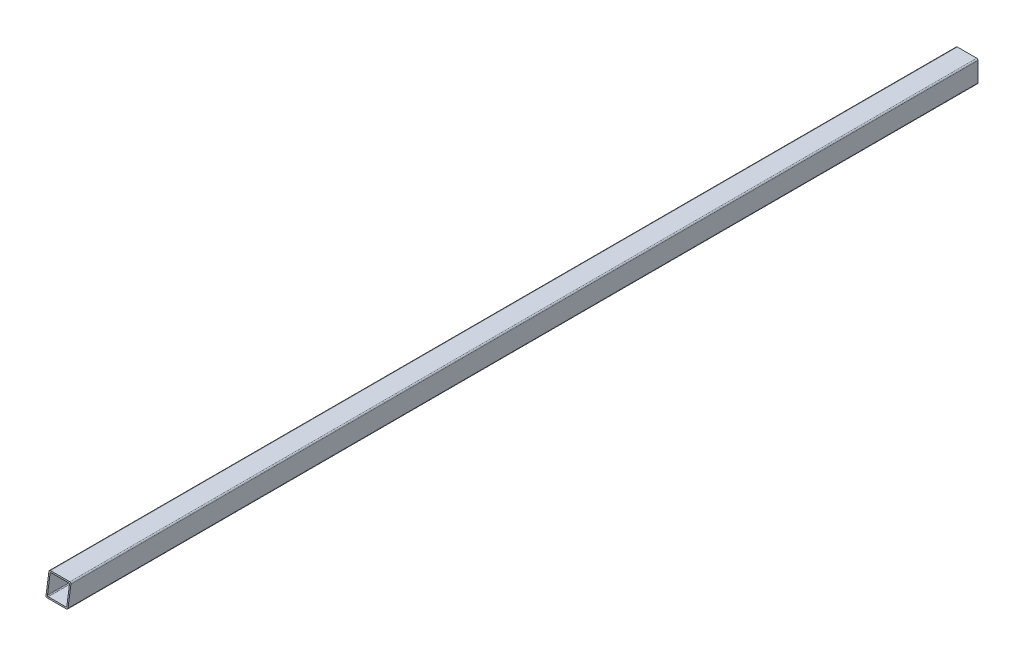
ISO-10303-21;
HEADER;
FILE_DESCRIPTION(('STEP AP214'),'2;1');
FILE_NAME('part.step','',(''),(''),'','','');
FILE_SCHEMA(('AUTOMOTIVE_DESIGN { 1 0 10303 214 1 1 1 1 }'));
ENDSEC;
DATA;
#1=APPLICATION_CONTEXT('core data for automotive mechanical design processes');
#2=APPLICATION_PROTOCOL_DEFINITION('international standard','automotive_design',2000,#1);
#3=PRODUCT_CONTEXT('',#1,'mechanical');
#4=PRODUCT('Part','Part','',(#3));
#5=PRODUCT_RELATED_PRODUCT_CATEGORY('part','',(#4));
#6=PRODUCT_DEFINITION_FORMATION('','',#4);
#7=PRODUCT_DEFINITION_CONTEXT('part definition',#1,'design');
#8=PRODUCT_DEFINITION('design','',#6,#7);
#9=PRODUCT_DEFINITION_SHAPE('','',#8);
#10=(LENGTH_UNIT() NAMED_UNIT(*) SI_UNIT(.MILLI.,.METRE.));
#11=(NAMED_UNIT(*) PLANE_ANGLE_UNIT() SI_UNIT($,.RADIAN.));
#12=(NAMED_UNIT(*) SI_UNIT($,.STERADIAN.) SOLID_ANGLE_UNIT());
#13=UNCERTAINTY_MEASURE_WITH_UNIT(LENGTH_MEASURE(1.E-05),#10,'distance_accuracy_value','');
#14=(GEOMETRIC_REPRESENTATION_CONTEXT(3) GLOBAL_UNCERTAINTY_ASSIGNED_CONTEXT((#13)) GLOBAL_UNIT_ASSIGNED_CONTEXT((#10,
#11,#12)) REPRESENTATION_CONTEXT('',''));
#15=CARTESIAN_POINT('',(0.,0.,0.));
#16=DIRECTION('',(0.,0.,1.));
#17=DIRECTION('',(1.,0.,0.));
#18=AXIS2_PLACEMENT_3D('',#15,#16,#17);
#19=CARTESIAN_POINT('',(5056.,2466.,100.000000000001));
#20=DIRECTION('',(0.,0.,1.));
#21=DIRECTION('',(1.,0.,0.));
#22=AXIS2_PLACEMENT_3D('',#19,#20,#21);
#23=PLANE('',#22);
#24=CARTESIAN_POINT('',(5056.,2466.,100.000000000001));
#25=DIRECTION('',(0.,0.,1.));
#26=DIRECTION('',(1.,0.,0.));
#27=AXIS2_PLACEMENT_3D('',#24,#25,#26);
#28=CIRCLE('',#27,6.00000000000023);
#29=CARTESIAN_POINT('',(5050.,2466.,100.000000000001));
#30=VERTEX_POINT('',#29);
#31=CARTESIAN_POINT('',(5056.,2460.,100.000000000001));
#32=VERTEX_POINT('',#31);
#33=EDGE_CURVE('E199',#30,#32,#28,.T.);
#34=ORIENTED_EDGE('',*,*,#33,.F.);
#35=DIRECTION('',(0.,-1.,0.));
#36=VECTOR('',#35,1.);
#37=CARTESIAN_POINT('',(5050.,2554.,100.000000000001));
#38=LINE('',#37,#36);
#39=CARTESIAN_POINT('',(5050.,2554.,100.000000000001));
#40=VERTEX_POINT('',#39);
#41=EDGE_CURVE('E161',#40,#30,#38,.T.);
#42=ORIENTED_EDGE('',*,*,#41,.F.);
#43=CARTESIAN_POINT('',(5056.,2554.,100.000000000001));
#44=DIRECTION('',(0.,0.,1.));
#45=DIRECTION('',(1.,0.,0.));
#46=AXIS2_PLACEMENT_3D('',#43,#44,#45);
#47=CIRCLE('',#46,6.00000000000001);
#48=CARTESIAN_POINT('',(5056.,2560.,100.000000000001));
#49=VERTEX_POINT('',#48);
#50=EDGE_CURVE('E157',#49,#40,#47,.T.);
#51=ORIENTED_EDGE('',*,*,#50,.F.);
#52=DIRECTION('',(-1.,0.,0.));
#53=VECTOR('',#52,1.);
#54=CARTESIAN_POINT('',(5056.,2560.,100.000000000001));
#55=LINE('',#54,#53);
#56=CARTESIAN_POINT('',(5144.,2560.,100.000000000001));
#57=VERTEX_POINT('',#56);
#58=EDGE_CURVE('E151',#57,#49,#55,.T.);
#59=ORIENTED_EDGE('',*,*,#58,.F.);
#60=CARTESIAN_POINT('',(5144.,2554.,100.000000000001));
#61=DIRECTION('',(0.,0.,1.));
#62=DIRECTION('',(-1.,0.,0.));
#63=AXIS2_PLACEMENT_3D('',#60,#61,#62);
#64=CIRCLE('',#63,6.00000000000001);
#65=CARTESIAN_POINT('',(5150.,2554.,100.000000000001));
#66=VERTEX_POINT('',#65);
#67=EDGE_CURVE('E218',#66,#57,#64,.T.);
#68=ORIENTED_EDGE('',*,*,#67,.F.);
#69=DIRECTION('',(0.,1.,0.));
#70=VECTOR('',#69,1.);
#71=CARTESIAN_POINT('',(5150.,2554.,100.000000000001));
#72=LINE('',#71,#70);
#73=CARTESIAN_POINT('',(5150.,2466.,100.000000000001));
#74=VERTEX_POINT('',#73);
#75=EDGE_CURVE('E208',#74,#66,#72,.T.);
#76=ORIENTED_EDGE('',*,*,#75,.F.);
#77=CARTESIAN_POINT('',(5144.,2466.,100.000000000001));
#78=DIRECTION('',(0.,0.,1.));
#79=DIRECTION('',(1.,0.,0.));
#80=AXIS2_PLACEMENT_3D('',#77,#78,#79);
#81=CIRCLE('',#80,6.00000000000023);
#82=CARTESIAN_POINT('',(5144.,2460.,100.000000000001));
#83=VERTEX_POINT('',#82);
#84=EDGE_CURVE('E214',#83,#74,#81,.T.);
#85=ORIENTED_EDGE('',*,*,#84,.F.);
#86=DIRECTION('',(1.,0.,0.));
#87=VECTOR('',#86,1.);
#88=CARTESIAN_POINT('',(5056.,2460.,100.000000000001));
#89=LINE('',#88,#87);
#90=EDGE_CURVE('E204',#32,#83,#89,.T.);
#91=ORIENTED_EDGE('',*,*,#90,.F.);
#92=EDGE_LOOP('',(#34,#42,#51,#59,#68,#76,#85,#91));
#93=FACE_BOUND('',#92,.T.);
#94=CARTESIAN_POINT('',(5060.,2470.,100.000000000001));
#95=DIRECTION('',(0.,0.,1.));
#96=DIRECTION('',(1.,0.,0.));
#97=AXIS2_PLACEMENT_3D('',#94,#95,#96);
#98=CIRCLE('',#97,3.99999999999978);
#99=CARTESIAN_POINT('',(5056.,2470.,100.000000000001));
#100=VERTEX_POINT('',#99);
#101=CARTESIAN_POINT('',(5060.,2466.,100.000000000001));
#102=VERTEX_POINT('',#101);
#103=EDGE_CURVE('E247',#100,#102,#98,.T.);
#104=ORIENTED_EDGE('',*,*,#103,.T.);
#105=DIRECTION('',(1.,0.,0.));
#106=VECTOR('',#105,1.);
#107=CARTESIAN_POINT('',(5060.,2466.,100.000000000001));
#108=LINE('',#107,#106);
#109=CARTESIAN_POINT('',(5140.,2466.,100.000000000001));
#110=VERTEX_POINT('',#109);
#111=EDGE_CURVE('E253',#102,#110,#108,.T.);
#112=ORIENTED_EDGE('',*,*,#111,.T.);
#113=CARTESIAN_POINT('',(5140.,2470.,100.000000000001));
#114=DIRECTION('',(0.,0.,1.));
#115=DIRECTION('',(1.,0.,0.));
#116=AXIS2_PLACEMENT_3D('',#113,#114,#115);
#117=CIRCLE('',#116,3.99999999999978);
#118=CARTESIAN_POINT('',(5144.,2470.,100.000000000001));
#119=VERTEX_POINT('',#118);
#120=EDGE_CURVE('E270',#110,#119,#117,.T.);
#121=ORIENTED_EDGE('',*,*,#120,.T.);
#122=DIRECTION('',(0.,1.,0.));
#123=VECTOR('',#122,1.);
#124=CARTESIAN_POINT('',(5144.,2550.,100.000000000001));
#125=LINE('',#124,#123);
#126=CARTESIAN_POINT('',(5144.,2550.,100.000000000001));
#127=VERTEX_POINT('',#126);
#128=EDGE_CURVE('E267',#119,#127,#125,.T.);
#129=ORIENTED_EDGE('',*,*,#128,.T.);
#130=CARTESIAN_POINT('',(5140.,2550.,100.000000000001));
#131=DIRECTION('',(0.,0.,1.));
#132=DIRECTION('',(-1.,0.,0.));
#133=AXIS2_PLACEMENT_3D('',#130,#131,#132);
#134=CIRCLE('',#133,3.99999999999978);
#135=CARTESIAN_POINT('',(5140.,2554.,100.000000000001));
#136=VERTEX_POINT('',#135);
#137=EDGE_CURVE('E264',#127,#136,#134,.T.);
#138=ORIENTED_EDGE('',*,*,#137,.T.);
#139=DIRECTION('',(-1.,0.,0.));
#140=VECTOR('',#139,1.);
#141=CARTESIAN_POINT('',(5060.,2554.,100.000000000001));
#142=LINE('',#141,#140);
#143=CARTESIAN_POINT('',(5060.,2554.,100.000000000001));
#144=VERTEX_POINT('',#143);
#145=EDGE_CURVE('E258',#136,#144,#142,.T.);
#146=ORIENTED_EDGE('',*,*,#145,.T.);
#147=CARTESIAN_POINT('',(5060.,2550.,100.000000000001));
#148=DIRECTION('',(0.,0.,1.));
#149=DIRECTION('',(1.,0.,0.));
#150=AXIS2_PLACEMENT_3D('',#147,#148,#149);
#151=CIRCLE('',#150,3.99999999999978);
#152=CARTESIAN_POINT('',(5056.,2550.,100.000000000001));
#153=VERTEX_POINT('',#152);
#154=EDGE_CURVE('E256',#144,#153,#151,.T.);
#155=ORIENTED_EDGE('',*,*,#154,.T.);
#156=DIRECTION('',(0.,-1.,0.));
#157=VECTOR('',#156,1.);
#158=CARTESIAN_POINT('',(5056.,2550.,100.000000000001));
#159=LINE('',#158,#157);
#160=EDGE_CURVE('E194',#153,#100,#159,.T.);
#161=ORIENTED_EDGE('',*,*,#160,.T.);
#162=EDGE_LOOP('',(#104,#112,#121,#129,#138,#146,#155,#161));
#163=FACE_BOUND('',#162,.T.);
#164=ADVANCED_FACE('F35',(#93,#163),#23,.F.);
#165=CARTESIAN_POINT('',(5056.,2466.,4369.08780731511));
#166=DIRECTION('',(0.,0.,-1.));
#167=DIRECTION('',(-1.,0.,0.));
#168=AXIS2_PLACEMENT_3D('',#165,#166,#167);
#169=CYLINDRICAL_SURFACE('',#168,6.00000000000023);
#170=DIRECTION('',(0.,0.,-1.));
#171=VECTOR('',#170,1.);
#172=CARTESIAN_POINT('',(5056.,2460.,4369.08780731511));
#173=LINE('',#172,#171);
#174=CARTESIAN_POINT('',(5056.,2460.,4234.32196361362));
#175=VERTEX_POINT('',#174);
#176=EDGE_CURVE('E198',#175,#32,#173,.T.);
#177=ORIENTED_EDGE('',*,*,#176,.F.);
#178=CARTESIAN_POINT('',(5056.,2466.,4233.4300659639));
#179=DIRECTION('',(0.,-0.147034000874357,-0.989131438478668));
#180=DIRECTION('',(0.,0.989131438478668,-0.147034000874357));
#181=AXIS2_PLACEMENT_3D('',#178,#179,#180);
#182=ELLIPSE('',#181,6.06592791068143,6.00000000000023);
#183=CARTESIAN_POINT('',(5050.,2466.,4233.4300659639));
#184=VERTEX_POINT('',#183);
#185=EDGE_CURVE('E192',#175,#184,#182,.T.);
#186=ORIENTED_EDGE('',*,*,#185,.T.);
#187=DIRECTION('',(0.,0.,-1.));
#188=VECTOR('',#187,1.);
#189=CARTESIAN_POINT('',(5050.,2466.,4369.08780731511));
#190=LINE('',#189,#188);
#191=EDGE_CURVE('E165',#184,#30,#190,.T.);
#192=ORIENTED_EDGE('',*,*,#191,.T.);
#193=ORIENTED_EDGE('',*,*,#33,.T.);
#194=EDGE_LOOP('',(#177,#186,#192,#193));
#195=FACE_BOUND('',#194,.T.);
#196=ADVANCED_FACE('F302',(#195),#169,.T.);
#197=CARTESIAN_POINT('',(5056.,2460.,4369.08780731511));
#198=DIRECTION('',(0.,1.,0.));
#199=DIRECTION('',(0.,0.,1.));
#200=AXIS2_PLACEMENT_3D('',#197,#198,#199);
#201=PLANE('',#200);
#202=DIRECTION('',(0.,0.,-1.));
#203=VECTOR('',#202,1.);
#204=CARTESIAN_POINT('',(5144.,2460.,4369.08780731511));
#205=LINE('',#204,#203);
#206=CARTESIAN_POINT('',(5144.,2460.,4234.32196361362));
#207=VERTEX_POINT('',#206);
#208=EDGE_CURVE('E203',#207,#83,#205,.T.);
#209=ORIENTED_EDGE('',*,*,#208,.F.);
#210=DIRECTION('',(-1.,0.,0.));
#211=VECTOR('',#210,1.);
#212=CARTESIAN_POINT('',(5056.,2460.,4234.32196361362));
#213=LINE('',#212,#211);
#214=EDGE_CURVE('E195',#207,#175,#213,.T.);
#215=ORIENTED_EDGE('',*,*,#214,.T.);
#216=ORIENTED_EDGE('',*,*,#176,.T.);
#217=ORIENTED_EDGE('',*,*,#90,.T.);
#218=EDGE_LOOP('',(#209,#215,#216,#217));
#219=FACE_BOUND('',#218,.T.);
#220=ADVANCED_FACE('F308',(#219),#201,.F.);
#221=CARTESIAN_POINT('',(5144.,2466.,4369.08780731511));
#222=DIRECTION('',(0.,0.,-1.));
#223=DIRECTION('',(-1.,0.,0.));
#224=AXIS2_PLACEMENT_3D('',#221,#222,#223);
#225=CYLINDRICAL_SURFACE('',#224,6.00000000000023);
#226=DIRECTION('',(0.,0.,-1.));
#227=VECTOR('',#226,1.);
#228=CARTESIAN_POINT('',(5150.,2466.,4369.08780731511));
#229=LINE('',#228,#227);
#230=CARTESIAN_POINT('',(5150.,2466.,4233.43006596389));
#231=VERTEX_POINT('',#230);
#232=EDGE_CURVE('E215',#231,#74,#229,.T.);
#233=ORIENTED_EDGE('',*,*,#232,.F.);
#234=CARTESIAN_POINT('',(5144.,2466.,4233.4300659639));
#235=DIRECTION('',(0.,-0.147034000874357,-0.989131438478668));
#236=DIRECTION('',(0.,0.989131438478668,-0.147034000874357));
#237=AXIS2_PLACEMENT_3D('',#234,#235,#236);
#238=ELLIPSE('',#237,6.06592791068143,6.00000000000023);
#239=EDGE_CURVE('E200',#231,#207,#238,.T.);
#240=ORIENTED_EDGE('',*,*,#239,.T.);
#241=ORIENTED_EDGE('',*,*,#208,.T.);
#242=ORIENTED_EDGE('',*,*,#84,.T.);
#243=EDGE_LOOP('',(#233,#240,#241,#242));
#244=FACE_BOUND('',#243,.T.);
#245=ADVANCED_FACE('F328',(#244),#225,.T.);
#246=CARTESIAN_POINT('',(5150.,2554.,4369.08780731511));
#247=DIRECTION('',(-1.,0.,0.));
#248=DIRECTION('',(0.,0.,1.));
#249=AXIS2_PLACEMENT_3D('',#246,#247,#248);
#250=PLANE('',#249);
#251=DIRECTION('',(0.,0.,-1.));
#252=VECTOR('',#251,1.);
#253=CARTESIAN_POINT('',(5150.,2554.,4369.08780731511));
#254=LINE('',#253,#252);
#255=CARTESIAN_POINT('',(5150.,2554.,4220.34890043463));
#256=VERTEX_POINT('',#255);
#257=EDGE_CURVE('E207',#256,#66,#254,.T.);
#258=ORIENTED_EDGE('',*,*,#257,.F.);
#259=DIRECTION('',(0.,0.989131438478668,-0.147034000874357));
#260=VECTOR('',#259,1.);
#261=CARTESIAN_POINT('',(5150.,2560.,4219.4570027849));
#262=LINE('',#261,#260);
#263=EDGE_CURVE('E11',#231,#256,#262,.T.);
#264=ORIENTED_EDGE('',*,*,#263,.F.);
#265=ORIENTED_EDGE('',*,*,#232,.T.);
#266=ORIENTED_EDGE('',*,*,#75,.T.);
#267=EDGE_LOOP('',(#258,#264,#265,#266));
#268=FACE_BOUND('',#267,.T.);
#269=ADVANCED_FACE('F324',(#268),#250,.F.);
#270=CARTESIAN_POINT('',(5144.,2554.,4369.08780731511));
#271=DIRECTION('',(0.,0.,-1.));
#272=DIRECTION('',(-1.,0.,0.));
#273=AXIS2_PLACEMENT_3D('',#270,#271,#272);
#274=CYLINDRICAL_SURFACE('',#273,6.00000000000001);
#275=DIRECTION('',(0.,0.,-1.));
#276=VECTOR('',#275,1.);
#277=CARTESIAN_POINT('',(5144.,2560.,4369.08780731511));
#278=LINE('',#277,#276);
#279=CARTESIAN_POINT('',(5144.,2560.,4219.4570027849));
#280=VERTEX_POINT('',#279);
#281=EDGE_CURVE('E219',#280,#57,#278,.T.);
#282=ORIENTED_EDGE('',*,*,#281,.F.);
#283=CARTESIAN_POINT('',(5144.,2554.,4220.34890043463));
#284=DIRECTION('',(0.,-0.147034000874357,-0.989131438478668));
#285=DIRECTION('',(0.,0.989131438478668,-0.147034000874357));
#286=AXIS2_PLACEMENT_3D('',#283,#284,#285);
#287=ELLIPSE('',#286,6.06592791068121,6.00000000000001);
#288=EDGE_CURVE('E205',#280,#256,#287,.T.);
#289=ORIENTED_EDGE('',*,*,#288,.T.);
#290=ORIENTED_EDGE('',*,*,#257,.T.);
#291=ORIENTED_EDGE('',*,*,#67,.T.);
#292=EDGE_LOOP('',(#282,#289,#290,#291));
#293=FACE_BOUND('',#292,.T.);
#294=ADVANCED_FACE('F320',(#293),#274,.T.);
#295=CARTESIAN_POINT('',(5056.,2560.,4369.08780731511));
#296=DIRECTION('',(0.,-1.,0.));
#297=DIRECTION('',(0.,0.,-1.));
#298=AXIS2_PLACEMENT_3D('',#295,#296,#297);
#299=PLANE('',#298);
#300=DIRECTION('',(0.,0.,-1.));
#301=VECTOR('',#300,1.);
#302=CARTESIAN_POINT('',(5056.,2560.,4369.08780731511));
#303=LINE('',#302,#301);
#304=CARTESIAN_POINT('',(5056.,2560.,4219.4570027849));
#305=VERTEX_POINT('',#304);
#306=EDGE_CURVE('E150',#305,#49,#303,.T.);
#307=ORIENTED_EDGE('',*,*,#306,.F.);
#308=DIRECTION('',(-1.,0.,0.));
#309=VECTOR('',#308,1.);
#310=CARTESIAN_POINT('',(0.,2560.,4219.4570027849));
#311=LINE('',#310,#309);
#312=EDGE_CURVE('E45',#280,#305,#311,.T.);
#313=ORIENTED_EDGE('',*,*,#312,.F.);
#314=ORIENTED_EDGE('',*,*,#281,.T.);
#315=ORIENTED_EDGE('',*,*,#58,.T.);
#316=EDGE_LOOP('',(#307,#313,#314,#315));
#317=FACE_BOUND('',#316,.T.);
#318=ADVANCED_FACE('F317',(#317),#299,.F.);
#319=CARTESIAN_POINT('',(5056.,2554.,4369.08780731511));
#320=DIRECTION('',(0.,0.,-1.));
#321=DIRECTION('',(-1.,0.,0.));
#322=AXIS2_PLACEMENT_3D('',#319,#320,#321);
#323=CYLINDRICAL_SURFACE('',#322,6.00000000000001);
#324=DIRECTION('',(0.,0.,-1.));
#325=VECTOR('',#324,1.);
#326=CARTESIAN_POINT('',(5050.,2554.,4369.08780731511));
#327=LINE('',#326,#325);
#328=CARTESIAN_POINT('',(5050.,2554.,4220.34890043463));
#329=VERTEX_POINT('',#328);
#330=EDGE_CURVE('E154',#329,#40,#327,.T.);
#331=ORIENTED_EDGE('',*,*,#330,.F.);
#332=CARTESIAN_POINT('',(5056.,2554.,4220.34890043463));
#333=DIRECTION('',(0.,-0.147034000874357,-0.989131438478668));
#334=DIRECTION('',(0.,0.989131438478668,-0.147034000874357));
#335=AXIS2_PLACEMENT_3D('',#332,#333,#334);
#336=ELLIPSE('',#335,6.06592791068121,6.00000000000001);
#337=EDGE_CURVE('E142',#329,#305,#336,.T.);
#338=ORIENTED_EDGE('',*,*,#337,.T.);
#339=ORIENTED_EDGE('',*,*,#306,.T.);
#340=ORIENTED_EDGE('',*,*,#50,.T.);
#341=EDGE_LOOP('',(#331,#338,#339,#340));
#342=FACE_BOUND('',#341,.T.);
#343=ADVANCED_FACE('F155',(#342),#323,.T.);
#344=CARTESIAN_POINT('',(5050.,2554.,4369.08780731511));
#345=DIRECTION('',(1.,0.,0.));
#346=DIRECTION('',(0.,0.,-1.));
#347=AXIS2_PLACEMENT_3D('',#344,#345,#346);
#348=PLANE('',#347);
#349=ORIENTED_EDGE('',*,*,#191,.F.);
#350=DIRECTION('',(0.,0.989131438478668,-0.147034000874357));
#351=VECTOR('',#350,1.);
#352=CARTESIAN_POINT('',(5050.,2532.36801536087,4223.56448647771));
#353=LINE('',#352,#351);
#354=EDGE_CURVE('E145',#184,#329,#353,.T.);
#355=ORIENTED_EDGE('',*,*,#354,.T.);
#356=ORIENTED_EDGE('',*,*,#330,.T.);
#357=ORIENTED_EDGE('',*,*,#41,.T.);
#358=EDGE_LOOP('',(#349,#355,#356,#357));
#359=FACE_BOUND('',#358,.T.);
#360=ADVANCED_FACE('F164',(#359),#348,.F.);
#361=CARTESIAN_POINT('',(5060.,2470.,4369.08780731511));
#362=DIRECTION('',(0.,0.,-1.));
#363=DIRECTION('',(-1.,0.,0.));
#364=AXIS2_PLACEMENT_3D('',#361,#362,#363);
#365=CYLINDRICAL_SURFACE('',#364,3.99999999999978);
#366=CARTESIAN_POINT('',(5060.,2470.,4232.83546753075));
#367=DIRECTION('',(0.,-0.147034000874357,-0.989131438478668));
#368=DIRECTION('',(0.,0.989131438478668,-0.147034000874357));
#369=AXIS2_PLACEMENT_3D('',#366,#367,#368);
#370=ELLIPSE('',#369,4.04395194045391,3.99999999999978);
#371=CARTESIAN_POINT('',(5060.,2466.,4233.4300659639));
#372=VERTEX_POINT('',#371);
#373=CARTESIAN_POINT('',(5056.,2470.,4232.83546753075));
#374=VERTEX_POINT('',#373);
#375=EDGE_CURVE('E170',#372,#374,#370,.T.);
#376=ORIENTED_EDGE('',*,*,#375,.F.);
#377=DIRECTION('',(0.,0.,-1.));
#378=VECTOR('',#377,1.);
#379=CARTESIAN_POINT('',(5060.,2466.,4369.08780731511));
#380=LINE('',#379,#378);
#381=EDGE_CURVE('E223',#372,#102,#380,.T.);
#382=ORIENTED_EDGE('',*,*,#381,.T.);
#383=ORIENTED_EDGE('',*,*,#103,.F.);
#384=DIRECTION('',(0.,0.,-1.));
#385=VECTOR('',#384,1.);
#386=CARTESIAN_POINT('',(5056.,2470.,4369.08780731511));
#387=LINE('',#386,#385);
#388=EDGE_CURVE('E39',#374,#100,#387,.T.);
#389=ORIENTED_EDGE('',*,*,#388,.F.);
#390=EDGE_LOOP('',(#376,#382,#383,#389));
#391=FACE_BOUND('',#390,.T.);
#392=ADVANCED_FACE('F248',(#391),#365,.F.);
#393=CARTESIAN_POINT('',(5060.,2466.,4369.08780731511));
#394=DIRECTION('',(0.,1.,0.));
#395=DIRECTION('',(0.,0.,1.));
#396=AXIS2_PLACEMENT_3D('',#393,#394,#395);
#397=PLANE('',#396);
#398=DIRECTION('',(-1.,0.,0.));
#399=VECTOR('',#398,1.);
#400=CARTESIAN_POINT('',(5060.,2466.,4233.4300659639));
#401=LINE('',#400,#399);
#402=CARTESIAN_POINT('',(5140.,2466.,4233.4300659639));
#403=VERTEX_POINT('',#402);
#404=EDGE_CURVE('E174',#403,#372,#401,.T.);
#405=ORIENTED_EDGE('',*,*,#404,.F.);
#406=DIRECTION('',(0.,0.,-1.));
#407=VECTOR('',#406,1.);
#408=CARTESIAN_POINT('',(5140.,2466.,4369.08780731511));
#409=LINE('',#408,#407);
#410=EDGE_CURVE('E225',#403,#110,#409,.T.);
#411=ORIENTED_EDGE('',*,*,#410,.T.);
#412=ORIENTED_EDGE('',*,*,#111,.F.);
#413=ORIENTED_EDGE('',*,*,#381,.F.);
#414=EDGE_LOOP('',(#405,#411,#412,#413));
#415=FACE_BOUND('',#414,.T.);
#416=ADVANCED_FACE('F275',(#415),#397,.T.);
#417=CARTESIAN_POINT('',(5140.,2470.,4369.08780731511));
#418=DIRECTION('',(0.,0.,-1.));
#419=DIRECTION('',(-1.,0.,0.));
#420=AXIS2_PLACEMENT_3D('',#417,#418,#419);
#421=CYLINDRICAL_SURFACE('',#420,3.99999999999978);
#422=CARTESIAN_POINT('',(5140.,2470.,4232.83546753075));
#423=DIRECTION('',(0.,-0.147034000874357,-0.989131438478668));
#424=DIRECTION('',(0.,0.989131438478668,-0.147034000874357));
#425=AXIS2_PLACEMENT_3D('',#422,#423,#424);
#426=ELLIPSE('',#425,4.04395194045391,3.99999999999978);
#427=CARTESIAN_POINT('',(5144.,2470.,4232.83546753075));
#428=VERTEX_POINT('',#427);
#429=EDGE_CURVE('E177',#428,#403,#426,.T.);
#430=ORIENTED_EDGE('',*,*,#429,.F.);
#431=DIRECTION('',(0.,0.,-1.));
#432=VECTOR('',#431,1.);
#433=CARTESIAN_POINT('',(5144.,2470.,4369.08780731511));
#434=LINE('',#433,#432);
#435=EDGE_CURVE('E227',#428,#119,#434,.T.);
#436=ORIENTED_EDGE('',*,*,#435,.T.);
#437=ORIENTED_EDGE('',*,*,#120,.F.);
#438=ORIENTED_EDGE('',*,*,#410,.F.);
#439=EDGE_LOOP('',(#430,#436,#437,#438));
#440=FACE_BOUND('',#439,.T.);
#441=ADVANCED_FACE('F278',(#440),#421,.F.);
#442=CARTESIAN_POINT('',(5144.,2550.,4369.08780731511));
#443=DIRECTION('',(-1.,0.,0.));
#444=DIRECTION('',(0.,0.,1.));
#445=AXIS2_PLACEMENT_3D('',#442,#443,#444);
#446=PLANE('',#445);
#447=DIRECTION('',(0.,-0.989131438478668,0.147034000874357));
#448=VECTOR('',#447,1.);
#449=CARTESIAN_POINT('',(5144.,2528.45449135053,4224.14623028887));
#450=LINE('',#449,#448);
#451=CARTESIAN_POINT('',(5144.,2550.,4220.94349886778));
#452=VERTEX_POINT('',#451);
#453=EDGE_CURVE('E180',#452,#428,#450,.T.);
#454=ORIENTED_EDGE('',*,*,#453,.F.);
#455=DIRECTION('',(0.,0.,-1.));
#456=VECTOR('',#455,1.);
#457=CARTESIAN_POINT('',(5144.,2550.,4369.08780731511));
#458=LINE('',#457,#456);
#459=EDGE_CURVE('E229',#452,#127,#458,.T.);
#460=ORIENTED_EDGE('',*,*,#459,.T.);
#461=ORIENTED_EDGE('',*,*,#128,.F.);
#462=ORIENTED_EDGE('',*,*,#435,.F.);
#463=EDGE_LOOP('',(#454,#460,#461,#462));
#464=FACE_BOUND('',#463,.T.);
#465=ADVANCED_FACE('F282',(#464),#446,.T.);
#466=CARTESIAN_POINT('',(5140.,2550.,4369.08780731511));
#467=DIRECTION('',(0.,0.,-1.));
#468=DIRECTION('',(-1.,0.,0.));
#469=AXIS2_PLACEMENT_3D('',#466,#467,#468);
#470=CYLINDRICAL_SURFACE('',#469,3.99999999999978);
#471=CARTESIAN_POINT('',(5140.,2550.,4220.94349886778));
#472=DIRECTION('',(0.,-0.147034000874357,-0.989131438478668));
#473=DIRECTION('',(0.,0.989131438478668,-0.147034000874357));
#474=AXIS2_PLACEMENT_3D('',#471,#472,#473);
#475=ELLIPSE('',#474,4.04395194045391,3.99999999999978);
#476=CARTESIAN_POINT('',(5140.,2554.,4220.34890043463));
#477=VERTEX_POINT('',#476);
#478=EDGE_CURVE('E183',#477,#452,#475,.T.);
#479=ORIENTED_EDGE('',*,*,#478,.F.);
#480=DIRECTION('',(0.,0.,-1.));
#481=VECTOR('',#480,1.);
#482=CARTESIAN_POINT('',(5140.,2554.,4369.08780731511));
#483=LINE('',#482,#481);
#484=EDGE_CURVE('E231',#477,#136,#483,.T.);
#485=ORIENTED_EDGE('',*,*,#484,.T.);
#486=ORIENTED_EDGE('',*,*,#137,.F.);
#487=ORIENTED_EDGE('',*,*,#459,.F.);
#488=EDGE_LOOP('',(#479,#485,#486,#487));
#489=FACE_BOUND('',#488,.T.);
#490=ADVANCED_FACE('F287',(#489),#470,.F.);
#491=CARTESIAN_POINT('',(5060.,2554.,4369.08780731511));
#492=DIRECTION('',(0.,-1.,0.));
#493=DIRECTION('',(0.,0.,-1.));
#494=AXIS2_PLACEMENT_3D('',#491,#492,#493);
#495=PLANE('',#494);
#496=DIRECTION('',(1.,0.,0.));
#497=VECTOR('',#496,1.);
#498=CARTESIAN_POINT('',(5060.,2554.,4220.34890043463));
#499=LINE('',#498,#497);
#500=CARTESIAN_POINT('',(5060.,2554.,4220.34890043463));
#501=VERTEX_POINT('',#500);
#502=EDGE_CURVE('E186',#501,#477,#499,.T.);
#503=ORIENTED_EDGE('',*,*,#502,.F.);
#504=DIRECTION('',(0.,0.,-1.));
#505=VECTOR('',#504,1.);
#506=CARTESIAN_POINT('',(5060.,2554.,4369.08780731511));
#507=LINE('',#506,#505);
#508=EDGE_CURVE('E233',#501,#144,#507,.T.);
#509=ORIENTED_EDGE('',*,*,#508,.T.);
#510=ORIENTED_EDGE('',*,*,#145,.F.);
#511=ORIENTED_EDGE('',*,*,#484,.F.);
#512=EDGE_LOOP('',(#503,#509,#510,#511));
#513=FACE_BOUND('',#512,.T.);
#514=ADVANCED_FACE('F290',(#513),#495,.T.);
#515=CARTESIAN_POINT('',(5060.,2550.,4369.08780731511));
#516=DIRECTION('',(0.,0.,-1.));
#517=DIRECTION('',(-1.,0.,0.));
#518=AXIS2_PLACEMENT_3D('',#515,#516,#517);
#519=CYLINDRICAL_SURFACE('',#518,3.99999999999978);
#520=CARTESIAN_POINT('',(5060.,2550.,4220.94349886778));
#521=DIRECTION('',(0.,-0.147034000874357,-0.989131438478668));
#522=DIRECTION('',(0.,0.989131438478668,-0.147034000874357));
#523=AXIS2_PLACEMENT_3D('',#520,#521,#522);
#524=ELLIPSE('',#523,4.04395194045391,3.99999999999978);
#525=CARTESIAN_POINT('',(5056.,2550.,4220.94349886778));
#526=VERTEX_POINT('',#525);
#527=EDGE_CURVE('E189',#526,#501,#524,.T.);
#528=ORIENTED_EDGE('',*,*,#527,.F.);
#529=DIRECTION('',(0.,0.,-1.));
#530=VECTOR('',#529,1.);
#531=CARTESIAN_POINT('',(5056.,2550.,4369.08780731511));
#532=LINE('',#531,#530);
#533=EDGE_CURVE('E234',#526,#153,#532,.T.);
#534=ORIENTED_EDGE('',*,*,#533,.T.);
#535=ORIENTED_EDGE('',*,*,#154,.F.);
#536=ORIENTED_EDGE('',*,*,#508,.F.);
#537=EDGE_LOOP('',(#528,#534,#535,#536));
#538=FACE_BOUND('',#537,.T.);
#539=ADVANCED_FACE('F292',(#538),#519,.F.);
#540=CARTESIAN_POINT('',(5056.,2550.,4369.08780731511));
#541=DIRECTION('',(1.,0.,0.));
#542=DIRECTION('',(0.,0.,-1.));
#543=AXIS2_PLACEMENT_3D('',#540,#541,#542);
#544=PLANE('',#543);
#545=DIRECTION('',(0.,0.989131438478668,-0.147034000874357));
#546=VECTOR('',#545,1.);
#547=CARTESIAN_POINT('',(5056.,2528.45449135053,4224.14623028887));
#548=LINE('',#547,#546);
#549=EDGE_CURVE('E173',#374,#526,#548,.T.);
#550=ORIENTED_EDGE('',*,*,#549,.F.);
#551=ORIENTED_EDGE('',*,*,#388,.T.);
#552=ORIENTED_EDGE('',*,*,#160,.F.);
#553=ORIENTED_EDGE('',*,*,#533,.F.);
#554=EDGE_LOOP('',(#550,#551,#552,#553));
#555=FACE_BOUND('',#554,.T.);
#556=ADVANCED_FACE('F242',(#555),#544,.T.);
#557=CARTESIAN_POINT('',(1.44222364974975E-13,669.005382834581,4500.55261189965));
#558=DIRECTION('',(0.,-0.147034000874357,-0.989131438478668));
#559=DIRECTION('',(0.,0.989131438478668,-0.147034000874357));
#560=AXIS2_PLACEMENT_3D('',#557,#558,#559);
#561=PLANE('',#560);
#562=ORIENTED_EDGE('',*,*,#404,.T.);
#563=ORIENTED_EDGE('',*,*,#375,.T.);
#564=ORIENTED_EDGE('',*,*,#549,.T.);
#565=ORIENTED_EDGE('',*,*,#527,.T.);
#566=ORIENTED_EDGE('',*,*,#502,.T.);
#567=ORIENTED_EDGE('',*,*,#478,.T.);
#568=ORIENTED_EDGE('',*,*,#453,.T.);
#569=ORIENTED_EDGE('',*,*,#429,.T.);
#570=EDGE_LOOP('',(#562,#563,#564,#565,#566,#567,#568,#569));
#571=FACE_BOUND('',#570,.T.);
#572=ORIENTED_EDGE('',*,*,#288,.F.);
#573=ORIENTED_EDGE('',*,*,#312,.T.);
#574=ORIENTED_EDGE('',*,*,#337,.F.);
#575=ORIENTED_EDGE('',*,*,#354,.F.);
#576=ORIENTED_EDGE('',*,*,#185,.F.);
#577=ORIENTED_EDGE('',*,*,#214,.F.);
#578=ORIENTED_EDGE('',*,*,#239,.F.);
#579=ORIENTED_EDGE('',*,*,#263,.T.);
#580=EDGE_LOOP('',(#572,#573,#574,#575,#576,#577,#578,#579));
#581=FACE_BOUND('',#580,.T.);
#582=ADVANCED_FACE('F37',(#571,#581),#561,.F.);
#583=CLOSED_SHELL('',(#164,#196,#220,#245,#269,#294,#318,#343,#360,#392,#416,#441,#465,#490,
#514,#539,#556,#582));
#584=MANIFOLD_SOLID_BREP('B2',#583);
#585=ADVANCED_BREP_SHAPE_REPRESENTATION('',(#18,#584),#14);
#586=SHAPE_DEFINITION_REPRESENTATION(#9,#585);
ENDSEC;
END-ISO-10303-21;
